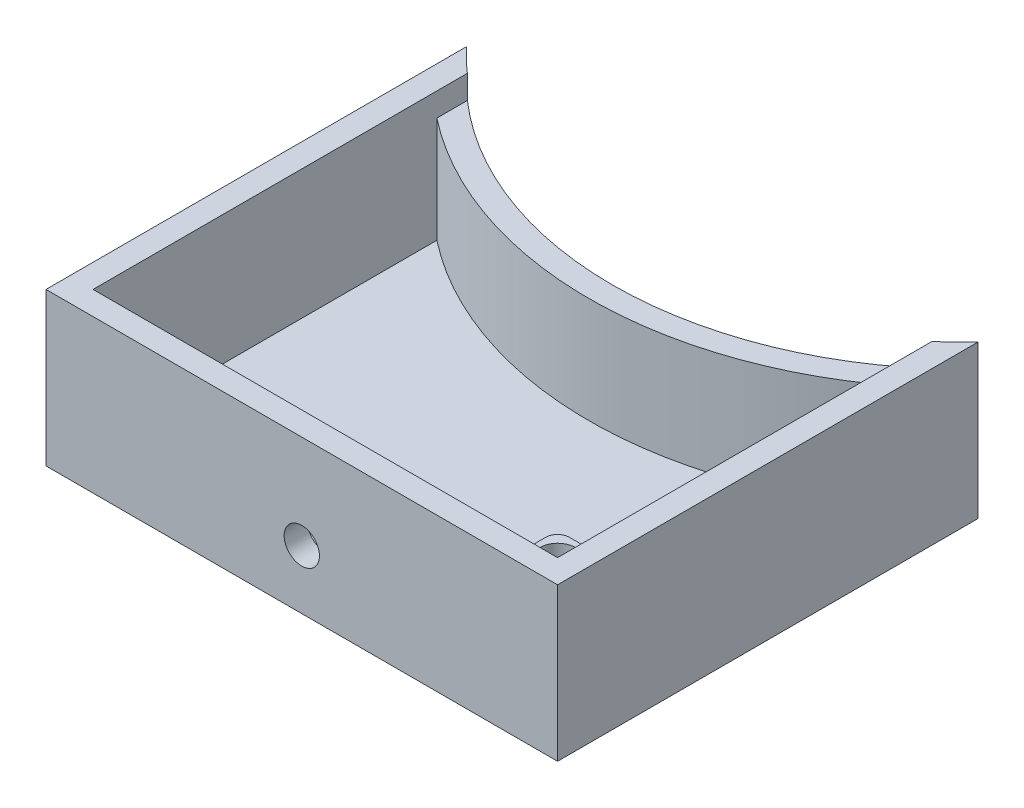
ISO-10303-21;
HEADER;
FILE_DESCRIPTION(('STEP AP214'),'2;1');
FILE_NAME('part.step','',(''),(''),'','','');
FILE_SCHEMA(('AUTOMOTIVE_DESIGN { 1 0 10303 214 1 1 1 1 }'));
ENDSEC;
DATA;
#1=APPLICATION_CONTEXT('core data for automotive mechanical design processes');
#2=APPLICATION_PROTOCOL_DEFINITION('international standard','automotive_design',2000,#1);
#3=PRODUCT_CONTEXT('',#1,'mechanical');
#4=PRODUCT('Part','Part','',(#3));
#5=PRODUCT_RELATED_PRODUCT_CATEGORY('part','',(#4));
#6=PRODUCT_DEFINITION_FORMATION('','',#4);
#7=PRODUCT_DEFINITION_CONTEXT('part definition',#1,'design');
#8=PRODUCT_DEFINITION('design','',#6,#7);
#9=PRODUCT_DEFINITION_SHAPE('','',#8);
#10=(LENGTH_UNIT() NAMED_UNIT(*) SI_UNIT(.MILLI.,.METRE.));
#11=(NAMED_UNIT(*) PLANE_ANGLE_UNIT() SI_UNIT($,.RADIAN.));
#12=(NAMED_UNIT(*) SI_UNIT($,.STERADIAN.) SOLID_ANGLE_UNIT());
#13=UNCERTAINTY_MEASURE_WITH_UNIT(LENGTH_MEASURE(1.E-05),#10,'distance_accuracy_value','');
#14=(GEOMETRIC_REPRESENTATION_CONTEXT(3) GLOBAL_UNCERTAINTY_ASSIGNED_CONTEXT((#13)) GLOBAL_UNIT_ASSIGNED_CONTEXT((#10,
#11,#12)) REPRESENTATION_CONTEXT('',''));
#15=CARTESIAN_POINT('',(0.,0.,0.));
#16=DIRECTION('',(0.,0.,1.));
#17=DIRECTION('',(1.,0.,0.));
#18=AXIS2_PLACEMENT_3D('',#15,#16,#17);
#19=CARTESIAN_POINT('',(0.,13.,15.875));
#20=DIRECTION('',(0.,0.,-1.));
#21=DIRECTION('',(-1.,0.,0.));
#22=AXIS2_PLACEMENT_3D('',#19,#20,#21);
#23=PLANE('',#22);
#24=CARTESIAN_POINT('',(0.,5.,15.875));
#25=DIRECTION('',(0.,0.,-1.));
#26=DIRECTION('',(-1.,0.,0.));
#27=AXIS2_PLACEMENT_3D('',#24,#25,#26);
#28=CIRCLE('',#27,1.5);
#29=CARTESIAN_POINT('',(-1.5,5.,15.875));
#30=VERTEX_POINT('',#29);
#31=EDGE_CURVE('E288',#30,#30,#28,.F.);
#32=ORIENTED_EDGE('',*,*,#31,.T.);
#33=EDGE_LOOP('',(#32));
#34=FACE_BOUND('',#33,.T.);
#35=DIRECTION('',(1.,0.,0.));
#36=VECTOR('',#35,1.);
#37=CARTESIAN_POINT('',(15.75,11.,15.875));
#38=LINE('',#37,#36);
#39=CARTESIAN_POINT('',(15.75,11.,15.875));
#40=VERTEX_POINT('',#39);
#41=CARTESIAN_POINT('',(19.75,11.,15.875));
#42=VERTEX_POINT('',#41);
#43=EDGE_CURVE('E135',#40,#42,#38,.T.);
#44=ORIENTED_EDGE('',*,*,#43,.F.);
#45=DIRECTION('',(0.,-1.,0.));
#46=VECTOR('',#45,1.);
#47=CARTESIAN_POINT('',(15.75,16.6568542494924,15.875));
#48=LINE('',#47,#46);
#49=CARTESIAN_POINT('',(15.75,2.,15.875));
#50=VERTEX_POINT('',#49);
#51=EDGE_CURVE('E220',#40,#50,#48,.T.);
#52=ORIENTED_EDGE('',*,*,#51,.T.);
#53=DIRECTION('',(1.,0.,0.));
#54=VECTOR('',#53,1.);
#55=CARTESIAN_POINT('',(0.,2.,15.875));
#56=LINE('',#55,#54);
#57=CARTESIAN_POINT('',(-19.75,2.,15.875));
#58=VERTEX_POINT('',#57);
#59=EDGE_CURVE('E171',#58,#50,#56,.T.);
#60=ORIENTED_EDGE('',*,*,#59,.F.);
#61=DIRECTION('',(0.,-1.,0.));
#62=VECTOR('',#61,1.);
#63=CARTESIAN_POINT('',(-19.75,13.,15.875));
#64=LINE('',#63,#62);
#65=CARTESIAN_POINT('',(-19.75,13.,15.875));
#66=VERTEX_POINT('',#65);
#67=EDGE_CURVE('E161',#66,#58,#64,.T.);
#68=ORIENTED_EDGE('',*,*,#67,.F.);
#69=DIRECTION('',(1.,0.,0.));
#70=VECTOR('',#69,1.);
#71=CARTESIAN_POINT('',(0.,13.,15.875));
#72=LINE('',#71,#70);
#73=CARTESIAN_POINT('',(19.75,13.,15.875));
#74=VERTEX_POINT('',#73);
#75=EDGE_CURVE('E159',#66,#74,#72,.T.);
#76=ORIENTED_EDGE('',*,*,#75,.T.);
#77=DIRECTION('',(0.,-1.,0.));
#78=VECTOR('',#77,1.);
#79=CARTESIAN_POINT('',(19.75,13.,15.875));
#80=LINE('',#79,#78);
#81=EDGE_CURVE('E150',#74,#42,#80,.T.);
#82=ORIENTED_EDGE('',*,*,#81,.T.);
#83=EDGE_LOOP('',(#44,#52,#60,#68,#76,#82));
#84=FACE_BOUND('',#83,.T.);
#85=ADVANCED_FACE('F35',(#34,#84),#23,.T.);
#86=CARTESIAN_POINT('',(19.75,13.,0.));
#87=DIRECTION('',(1.,0.,0.));
#88=DIRECTION('',(0.,0.,-1.));
#89=AXIS2_PLACEMENT_3D('',#86,#87,#88);
#90=PLANE('',#89);
#91=DIRECTION('',(0.,-1.,0.));
#92=VECTOR('',#91,1.);
#93=CARTESIAN_POINT('',(19.75,16.6568542494924,11.875));
#94=LINE('',#93,#92);
#95=CARTESIAN_POINT('',(19.75,11.,11.875));
#96=VERTEX_POINT('',#95);
#97=CARTESIAN_POINT('',(19.75,2.,11.875));
#98=VERTEX_POINT('',#97);
#99=EDGE_CURVE('E153',#96,#98,#94,.T.);
#100=ORIENTED_EDGE('',*,*,#99,.F.);
#101=DIRECTION('',(0.,0.,-1.));
#102=VECTOR('',#101,1.);
#103=CARTESIAN_POINT('',(19.75,11.,11.875));
#104=LINE('',#103,#102);
#105=EDGE_CURVE('E138',#42,#96,#104,.T.);
#106=ORIENTED_EDGE('',*,*,#105,.F.);
#107=ORIENTED_EDGE('',*,*,#81,.F.);
#108=DIRECTION('',(0.,0.,1.));
#109=VECTOR('',#108,1.);
#110=CARTESIAN_POINT('',(19.75,13.,0.));
#111=LINE('',#110,#109);
#112=CARTESIAN_POINT('',(19.75,13.,-15.9556702053177));
#113=VERTEX_POINT('',#112);
#114=EDGE_CURVE('E167',#113,#74,#111,.T.);
#115=ORIENTED_EDGE('',*,*,#114,.F.);
#116=DIRECTION('',(0.,1.,0.));
#117=VECTOR('',#116,1.);
#118=CARTESIAN_POINT('',(19.75,11.,-15.9556702053177));
#119=LINE('',#118,#117);
#120=CARTESIAN_POINT('',(19.75,11.,-15.9556702053177));
#121=VERTEX_POINT('',#120);
#122=EDGE_CURVE('E276',#121,#113,#119,.T.);
#123=ORIENTED_EDGE('',*,*,#122,.F.);
#124=DIRECTION('',(0.,0.,1.));
#125=VECTOR('',#124,1.);
#126=CARTESIAN_POINT('',(19.75,11.,0.));
#127=LINE('',#126,#125);
#128=CARTESIAN_POINT('',(19.75,11.,-13.3593504735421));
#129=VERTEX_POINT('',#128);
#130=EDGE_CURVE('E283',#121,#129,#127,.T.);
#131=ORIENTED_EDGE('',*,*,#130,.T.);
#132=DIRECTION('',(0.,-1.,0.));
#133=VECTOR('',#132,1.);
#134=CARTESIAN_POINT('',(19.75,13.,-13.3593504735421));
#135=LINE('',#134,#133);
#136=CARTESIAN_POINT('',(19.75,2.,-13.3593504735421));
#137=VERTEX_POINT('',#136);
#138=EDGE_CURVE('E162',#129,#137,#135,.T.);
#139=ORIENTED_EDGE('',*,*,#138,.T.);
#140=DIRECTION('',(0.,0.,1.));
#141=VECTOR('',#140,1.);
#142=CARTESIAN_POINT('',(19.75,2.,0.));
#143=LINE('',#142,#141);
#144=EDGE_CURVE('E172',#137,#98,#143,.T.);
#145=ORIENTED_EDGE('',*,*,#144,.T.);
#146=EDGE_LOOP('',(#100,#106,#107,#115,#123,#131,#139,#145));
#147=FACE_BOUND('',#146,.T.);
#148=ADVANCED_FACE('F149',(#147),#90,.F.);
#149=CARTESIAN_POINT('',(0.,13.,0.));
#150=DIRECTION('',(0.,1.,0.));
#151=DIRECTION('',(0.,0.,1.));
#152=AXIS2_PLACEMENT_3D('',#149,#150,#151);
#153=PLANE('',#152);
#154=CARTESIAN_POINT('',(0.,13.,-38.5374659709339));
#155=DIRECTION('',(0.,1.,0.));
#156=DIRECTION('',(0.,0.,1.));
#157=AXIS2_PLACEMENT_3D('',#154,#155,#156);
#158=CIRCLE('',#157,30.);
#159=CARTESIAN_POINT('',(21.75,13.,-17.875));
#160=VERTEX_POINT('',#159);
#161=EDGE_CURVE('E182',#113,#160,#158,.T.);
#162=ORIENTED_EDGE('',*,*,#161,.F.);
#163=ORIENTED_EDGE('',*,*,#114,.T.);
#164=ORIENTED_EDGE('',*,*,#75,.F.);
#165=DIRECTION('',(0.,0.,1.));
#166=VECTOR('',#165,1.);
#167=CARTESIAN_POINT('',(-19.75,13.,0.));
#168=LINE('',#167,#166);
#169=CARTESIAN_POINT('',(-19.75,13.,-15.9556702053177));
#170=VERTEX_POINT('',#169);
#171=EDGE_CURVE('E174',#170,#66,#168,.T.);
#172=ORIENTED_EDGE('',*,*,#171,.F.);
#173=CARTESIAN_POINT('',(-21.75,13.,-17.875));
#174=VERTEX_POINT('',#173);
#175=EDGE_CURVE('E178',#174,#170,#158,.T.);
#176=ORIENTED_EDGE('',*,*,#175,.F.);
#177=DIRECTION('',(0.,0.,1.));
#178=VECTOR('',#177,1.);
#179=CARTESIAN_POINT('',(-21.75,13.,0.));
#180=LINE('',#179,#178);
#181=CARTESIAN_POINT('',(-21.75,13.,17.875));
#182=VERTEX_POINT('',#181);
#183=EDGE_CURVE('E181',#174,#182,#180,.T.);
#184=ORIENTED_EDGE('',*,*,#183,.T.);
#185=DIRECTION('',(1.,0.,0.));
#186=VECTOR('',#185,1.);
#187=CARTESIAN_POINT('',(0.,13.,17.875));
#188=LINE('',#187,#186);
#189=CARTESIAN_POINT('',(21.75,13.,17.875));
#190=VERTEX_POINT('',#189);
#191=EDGE_CURVE('E184',#182,#190,#188,.T.);
#192=ORIENTED_EDGE('',*,*,#191,.T.);
#193=DIRECTION('',(0.,0.,1.));
#194=VECTOR('',#193,1.);
#195=CARTESIAN_POINT('',(21.75,13.,0.));
#196=LINE('',#195,#194);
#197=EDGE_CURVE('E186',#160,#190,#196,.T.);
#198=ORIENTED_EDGE('',*,*,#197,.F.);
#199=EDGE_LOOP('',(#162,#163,#164,#172,#176,#184,#192,#198));
#200=FACE_BOUND('',#199,.T.);
#201=ADVANCED_FACE('F236',(#200),#153,.T.);
#202=CARTESIAN_POINT('',(0.,13.,-38.5374659709339));
#203=DIRECTION('',(0.,-1.,0.));
#204=DIRECTION('',(0.,0.,-1.));
#205=AXIS2_PLACEMENT_3D('',#202,#203,#204);
#206=CYLINDRICAL_SURFACE('',#205,30.);
#207=CARTESIAN_POINT('',(0.,11.,-38.5374659709339));
#208=DIRECTION('',(0.,1.,0.));
#209=DIRECTION('',(0.,0.,1.));
#210=AXIS2_PLACEMENT_3D('',#207,#208,#209);
#211=CIRCLE('',#210,30.);
#212=CARTESIAN_POINT('',(-19.75,11.,-15.9556702053177));
#213=VERTEX_POINT('',#212);
#214=EDGE_CURVE('E275',#121,#213,#211,.F.);
#215=ORIENTED_EDGE('',*,*,#214,.F.);
#216=ORIENTED_EDGE('',*,*,#122,.T.);
#217=ORIENTED_EDGE('',*,*,#161,.T.);
#218=DIRECTION('',(0.,-1.,0.));
#219=VECTOR('',#218,1.);
#220=CARTESIAN_POINT('',(21.75,13.,-17.875));
#221=LINE('',#220,#219);
#222=CARTESIAN_POINT('',(21.75,0.,-17.875));
#223=VERTEX_POINT('',#222);
#224=EDGE_CURVE('E189',#160,#223,#221,.T.);
#225=ORIENTED_EDGE('',*,*,#224,.T.);
#226=CARTESIAN_POINT('',(0.,0.,-38.5374659709339));
#227=DIRECTION('',(0.,1.,0.));
#228=DIRECTION('',(0.,0.,1.));
#229=AXIS2_PLACEMENT_3D('',#226,#227,#228);
#230=CIRCLE('',#229,30.);
#231=CARTESIAN_POINT('',(-21.75,0.,-17.875));
#232=VERTEX_POINT('',#231);
#233=EDGE_CURVE('E190',#232,#223,#230,.T.);
#234=ORIENTED_EDGE('',*,*,#233,.F.);
#235=DIRECTION('',(0.,-1.,0.));
#236=VECTOR('',#235,1.);
#237=CARTESIAN_POINT('',(-21.75,13.,-17.875));
#238=LINE('',#237,#236);
#239=EDGE_CURVE('E207',#174,#232,#238,.T.);
#240=ORIENTED_EDGE('',*,*,#239,.F.);
#241=ORIENTED_EDGE('',*,*,#175,.T.);
#242=DIRECTION('',(0.,1.,0.));
#243=VECTOR('',#242,1.);
#244=CARTESIAN_POINT('',(-19.75,11.,-15.9556702053177));
#245=LINE('',#244,#243);
#246=EDGE_CURVE('E279',#213,#170,#245,.T.);
#247=ORIENTED_EDGE('',*,*,#246,.F.);
#248=EDGE_LOOP('',(#215,#216,#217,#225,#234,#240,#241,#247));
#249=FACE_BOUND('',#248,.T.);
#250=ADVANCED_FACE('F247',(#249),#206,.F.);
#251=CARTESIAN_POINT('',(0.,13.,-38.5374659709339));
#252=DIRECTION('',(0.,-1.,0.));
#253=DIRECTION('',(0.,0.,-1.));
#254=AXIS2_PLACEMENT_3D('',#251,#252,#253);
#255=CYLINDRICAL_SURFACE('',#254,32.);
#256=CARTESIAN_POINT('',(0.,11.,-38.5374659709339));
#257=DIRECTION('',(0.,1.,0.));
#258=DIRECTION('',(0.,0.,1.));
#259=AXIS2_PLACEMENT_3D('',#256,#257,#258);
#260=CIRCLE('',#259,32.);
#261=CARTESIAN_POINT('',(-19.75,11.,-13.3593504735421));
#262=VERTEX_POINT('',#261);
#263=EDGE_CURVE('E285',#262,#129,#260,.T.);
#264=ORIENTED_EDGE('',*,*,#263,.F.);
#265=DIRECTION('',(0.,-1.,0.));
#266=VECTOR('',#265,1.);
#267=CARTESIAN_POINT('',(-19.75,13.,-13.3593504735421));
#268=LINE('',#267,#266);
#269=CARTESIAN_POINT('',(-19.75,2.,-13.3593504735421));
#270=VERTEX_POINT('',#269);
#271=EDGE_CURVE('E165',#262,#270,#268,.T.);
#272=ORIENTED_EDGE('',*,*,#271,.T.);
#273=CARTESIAN_POINT('',(0.,2.,-38.5374659709339));
#274=DIRECTION('',(0.,1.,0.));
#275=DIRECTION('',(0.,0.,1.));
#276=AXIS2_PLACEMENT_3D('',#273,#274,#275);
#277=CIRCLE('',#276,32.);
#278=EDGE_CURVE('E294',#270,#137,#277,.T.);
#279=ORIENTED_EDGE('',*,*,#278,.T.);
#280=ORIENTED_EDGE('',*,*,#138,.F.);
#281=EDGE_LOOP('',(#264,#272,#279,#280));
#282=FACE_BOUND('',#281,.T.);
#283=ADVANCED_FACE('F263',(#282),#255,.T.);
#284=CARTESIAN_POINT('',(-21.75,13.,0.));
#285=DIRECTION('',(1.,0.,0.));
#286=DIRECTION('',(0.,0.,-1.));
#287=AXIS2_PLACEMENT_3D('',#284,#285,#286);
#288=PLANE('',#287);
#289=DIRECTION('',(0.,0.,1.));
#290=VECTOR('',#289,1.);
#291=CARTESIAN_POINT('',(-21.75,0.,0.));
#292=LINE('',#291,#290);
#293=CARTESIAN_POINT('',(-21.75,0.,17.875));
#294=VERTEX_POINT('',#293);
#295=EDGE_CURVE('E193',#232,#294,#292,.T.);
#296=ORIENTED_EDGE('',*,*,#295,.T.);
#297=DIRECTION('',(0.,-1.,0.));
#298=VECTOR('',#297,1.);
#299=CARTESIAN_POINT('',(-21.75,13.,17.875));
#300=LINE('',#299,#298);
#301=EDGE_CURVE('E204',#182,#294,#300,.T.);
#302=ORIENTED_EDGE('',*,*,#301,.F.);
#303=ORIENTED_EDGE('',*,*,#183,.F.);
#304=ORIENTED_EDGE('',*,*,#239,.T.);
#305=EDGE_LOOP('',(#296,#302,#303,#304));
#306=FACE_BOUND('',#305,.T.);
#307=ADVANCED_FACE('F260',(#306),#288,.F.);
#308=CARTESIAN_POINT('',(0.,13.,17.875));
#309=DIRECTION('',(0.,0.,-1.));
#310=DIRECTION('',(-1.,0.,0.));
#311=AXIS2_PLACEMENT_3D('',#308,#309,#310);
#312=PLANE('',#311);
#313=CARTESIAN_POINT('',(0.,5.,17.875));
#314=DIRECTION('',(0.,0.,1.));
#315=DIRECTION('',(1.,0.,0.));
#316=AXIS2_PLACEMENT_3D('',#313,#314,#315);
#317=CIRCLE('',#316,1.5);
#318=CARTESIAN_POINT('',(1.5,5.,17.875));
#319=VERTEX_POINT('',#318);
#320=EDGE_CURVE('E306',#319,#319,#317,.T.);
#321=ORIENTED_EDGE('',*,*,#320,.F.);
#322=EDGE_LOOP('',(#321));
#323=FACE_BOUND('',#322,.T.);
#324=DIRECTION('',(1.,0.,0.));
#325=VECTOR('',#324,1.);
#326=CARTESIAN_POINT('',(0.,0.,17.875));
#327=LINE('',#326,#325);
#328=CARTESIAN_POINT('',(21.75,0.,17.875));
#329=VERTEX_POINT('',#328);
#330=EDGE_CURVE('E195',#294,#329,#327,.T.);
#331=ORIENTED_EDGE('',*,*,#330,.T.);
#332=DIRECTION('',(0.,-1.,0.));
#333=VECTOR('',#332,1.);
#334=CARTESIAN_POINT('',(21.75,13.,17.875));
#335=LINE('',#334,#333);
#336=EDGE_CURVE('E202',#190,#329,#335,.T.);
#337=ORIENTED_EDGE('',*,*,#336,.F.);
#338=ORIENTED_EDGE('',*,*,#191,.F.);
#339=ORIENTED_EDGE('',*,*,#301,.T.);
#340=EDGE_LOOP('',(#331,#337,#338,#339));
#341=FACE_BOUND('',#340,.T.);
#342=ADVANCED_FACE('F256',(#323,#341),#312,.F.);
#343=CARTESIAN_POINT('',(21.75,13.,0.));
#344=DIRECTION('',(1.,0.,0.));
#345=DIRECTION('',(0.,0.,-1.));
#346=AXIS2_PLACEMENT_3D('',#343,#344,#345);
#347=PLANE('',#346);
#348=DIRECTION('',(0.,0.,1.));
#349=VECTOR('',#348,1.);
#350=CARTESIAN_POINT('',(21.75,0.,0.));
#351=LINE('',#350,#349);
#352=EDGE_CURVE('E198',#223,#329,#351,.T.);
#353=ORIENTED_EDGE('',*,*,#352,.F.);
#354=ORIENTED_EDGE('',*,*,#224,.F.);
#355=ORIENTED_EDGE('',*,*,#197,.T.);
#356=ORIENTED_EDGE('',*,*,#336,.T.);
#357=EDGE_LOOP('',(#353,#354,#355,#356));
#358=FACE_BOUND('',#357,.T.);
#359=ADVANCED_FACE('F252',(#358),#347,.T.);
#360=CARTESIAN_POINT('',(0.,0.,0.));
#361=DIRECTION('',(0.,1.,0.));
#362=DIRECTION('',(0.,0.,1.));
#363=AXIS2_PLACEMENT_3D('',#360,#361,#362);
#364=PLANE('',#363);
#365=ORIENTED_EDGE('',*,*,#233,.T.);
#366=ORIENTED_EDGE('',*,*,#352,.T.);
#367=ORIENTED_EDGE('',*,*,#330,.F.);
#368=ORIENTED_EDGE('',*,*,#295,.F.);
#369=EDGE_LOOP('',(#365,#366,#367,#368));
#370=FACE_BOUND('',#369,.T.);
#371=ADVANCED_FACE('F249',(#370),#364,.F.);
#372=CARTESIAN_POINT('',(-19.75,13.,0.));
#373=DIRECTION('',(1.,0.,0.));
#374=DIRECTION('',(0.,0.,-1.));
#375=AXIS2_PLACEMENT_3D('',#372,#373,#374);
#376=PLANE('',#375);
#377=DIRECTION('',(0.,0.,1.));
#378=VECTOR('',#377,1.);
#379=CARTESIAN_POINT('',(-19.75,2.,0.));
#380=LINE('',#379,#378);
#381=EDGE_CURVE('E298',#270,#58,#380,.T.);
#382=ORIENTED_EDGE('',*,*,#381,.F.);
#383=ORIENTED_EDGE('',*,*,#271,.F.);
#384=DIRECTION('',(0.,0.,1.));
#385=VECTOR('',#384,1.);
#386=CARTESIAN_POINT('',(-19.75,11.,0.));
#387=LINE('',#386,#385);
#388=EDGE_CURVE('E282',#213,#262,#387,.T.);
#389=ORIENTED_EDGE('',*,*,#388,.F.);
#390=ORIENTED_EDGE('',*,*,#246,.T.);
#391=ORIENTED_EDGE('',*,*,#171,.T.);
#392=ORIENTED_EDGE('',*,*,#67,.T.);
#393=EDGE_LOOP('',(#382,#383,#389,#390,#391,#392));
#394=FACE_BOUND('',#393,.T.);
#395=ADVANCED_FACE('F240',(#394),#376,.T.);
#396=CARTESIAN_POINT('',(0.,2.,0.));
#397=DIRECTION('',(0.,1.,0.));
#398=DIRECTION('',(0.,0.,1.));
#399=AXIS2_PLACEMENT_3D('',#396,#397,#398);
#400=PLANE('',#399);
#401=ORIENTED_EDGE('',*,*,#59,.T.);
#402=DIRECTION('',(0.,0.,1.));
#403=VECTOR('',#402,1.);
#404=CARTESIAN_POINT('',(15.75,2.,11.875));
#405=LINE('',#404,#403);
#406=CARTESIAN_POINT('',(15.75,2.,12.875));
#407=VERTEX_POINT('',#406);
#408=EDGE_CURVE('E304',#407,#50,#405,.T.);
#409=ORIENTED_EDGE('',*,*,#408,.F.);
#410=CARTESIAN_POINT('',(16.75,2.,12.875));
#411=DIRECTION('',(0.,1.,0.));
#412=DIRECTION('',(0.,0.,1.));
#413=AXIS2_PLACEMENT_3D('',#410,#411,#412);
#414=CIRCLE('',#413,1.);
#415=CARTESIAN_POINT('',(16.75,2.,11.875));
#416=VERTEX_POINT('',#415);
#417=EDGE_CURVE('E11',#407,#416,#414,.F.);
#418=ORIENTED_EDGE('',*,*,#417,.T.);
#419=DIRECTION('',(-1.,0.,0.));
#420=VECTOR('',#419,1.);
#421=CARTESIAN_POINT('',(15.75,2.,11.875));
#422=LINE('',#421,#420);
#423=EDGE_CURVE('E154',#98,#416,#422,.T.);
#424=ORIENTED_EDGE('',*,*,#423,.F.);
#425=ORIENTED_EDGE('',*,*,#144,.F.);
#426=ORIENTED_EDGE('',*,*,#278,.F.);
#427=ORIENTED_EDGE('',*,*,#381,.T.);
#428=EDGE_LOOP('',(#401,#409,#418,#424,#425,#426,#427));
#429=FACE_BOUND('',#428,.T.);
#430=ADVANCED_FACE('F229',(#429),#400,.T.);
#431=CARTESIAN_POINT('',(0.,11.,0.));
#432=DIRECTION('',(0.,1.,0.));
#433=DIRECTION('',(0.,0.,1.));
#434=AXIS2_PLACEMENT_3D('',#431,#432,#433);
#435=PLANE('',#434);
#436=ORIENTED_EDGE('',*,*,#130,.F.);
#437=ORIENTED_EDGE('',*,*,#214,.T.);
#438=ORIENTED_EDGE('',*,*,#388,.T.);
#439=ORIENTED_EDGE('',*,*,#263,.T.);
#440=EDGE_LOOP('',(#436,#437,#438,#439));
#441=FACE_BOUND('',#440,.T.);
#442=ADVANCED_FACE('F244',(#441),#435,.T.);
#443=CARTESIAN_POINT('',(0.,5.,-17.876));
#444=DIRECTION('',(0.,0.,1.));
#445=DIRECTION('',(1.,0.,0.));
#446=AXIS2_PLACEMENT_3D('',#443,#444,#445);
#447=CYLINDRICAL_SURFACE('',#446,1.5);
#448=ORIENTED_EDGE('',*,*,#31,.F.);
#449=EDGE_LOOP('',(#448));
#450=FACE_BOUND('',#449,.T.);
#451=ORIENTED_EDGE('',*,*,#320,.T.);
#452=EDGE_LOOP('',(#451));
#453=FACE_BOUND('',#452,.T.);
#454=ADVANCED_FACE('F316',(#450,#453),#447,.F.);
#455=CARTESIAN_POINT('',(15.75,16.6568542494924,11.875));
#456=DIRECTION('',(1.,0.,0.));
#457=DIRECTION('',(0.,0.,-1.));
#458=AXIS2_PLACEMENT_3D('',#455,#456,#457);
#459=PLANE('',#458);
#460=DIRECTION('',(0.,0.,1.));
#461=VECTOR('',#460,1.);
#462=CARTESIAN_POINT('',(15.75,11.,11.875));
#463=LINE('',#462,#461);
#464=CARTESIAN_POINT('',(15.75,11.,12.875));
#465=VERTEX_POINT('',#464);
#466=EDGE_CURVE('E141',#465,#40,#463,.T.);
#467=ORIENTED_EDGE('',*,*,#466,.F.);
#468=DIRECTION('',(0.,-1.,0.));
#469=VECTOR('',#468,1.);
#470=CARTESIAN_POINT('',(15.75,16.6568542494924,12.875));
#471=LINE('',#470,#469);
#472=EDGE_CURVE('E212',#465,#407,#471,.T.);
#473=ORIENTED_EDGE('',*,*,#472,.T.);
#474=ORIENTED_EDGE('',*,*,#408,.T.);
#475=ORIENTED_EDGE('',*,*,#51,.F.);
#476=EDGE_LOOP('',(#467,#473,#474,#475));
#477=FACE_BOUND('',#476,.T.);
#478=ADVANCED_FACE('F219',(#477),#459,.F.);
#479=CARTESIAN_POINT('',(15.75,16.6568542494924,11.875));
#480=DIRECTION('',(0.,0.,1.));
#481=DIRECTION('',(1.,0.,0.));
#482=AXIS2_PLACEMENT_3D('',#479,#480,#481);
#483=PLANE('',#482);
#484=ORIENTED_EDGE('',*,*,#423,.T.);
#485=DIRECTION('',(0.,-1.,0.));
#486=VECTOR('',#485,1.);
#487=CARTESIAN_POINT('',(16.75,16.6568542494924,11.875));
#488=LINE('',#487,#486);
#489=CARTESIAN_POINT('',(16.75,11.,11.875));
#490=VERTEX_POINT('',#489);
#491=EDGE_CURVE('E55',#416,#490,#488,.F.);
#492=ORIENTED_EDGE('',*,*,#491,.T.);
#493=DIRECTION('',(-1.,0.,0.));
#494=VECTOR('',#493,1.);
#495=CARTESIAN_POINT('',(15.75,11.,11.875));
#496=LINE('',#495,#494);
#497=EDGE_CURVE('E155',#96,#490,#496,.T.);
#498=ORIENTED_EDGE('',*,*,#497,.F.);
#499=ORIENTED_EDGE('',*,*,#99,.T.);
#500=EDGE_LOOP('',(#484,#492,#498,#499));
#501=FACE_BOUND('',#500,.T.);
#502=ADVANCED_FACE('F335',(#501),#483,.F.);
#503=CARTESIAN_POINT('',(17.75,16.6568542494924,13.875));
#504=DIRECTION('',(0.,-1.,0.));
#505=DIRECTION('',(0.,0.,-1.));
#506=AXIS2_PLACEMENT_3D('',#503,#504,#505);
#507=CYLINDRICAL_SURFACE('',#506,1.5);
#508=CARTESIAN_POINT('',(17.75,2.,13.875));
#509=DIRECTION('',(0.,1.,0.));
#510=DIRECTION('',(0.,0.,1.));
#511=AXIS2_PLACEMENT_3D('',#508,#509,#510);
#512=CIRCLE('',#511,1.5);
#513=CARTESIAN_POINT('',(17.75,2.,15.375));
#514=VERTEX_POINT('',#513);
#515=EDGE_CURVE('E209',#514,#514,#512,.F.);
#516=ORIENTED_EDGE('',*,*,#515,.T.);
#517=EDGE_LOOP('',(#516));
#518=FACE_BOUND('',#517,.T.);
#519=CARTESIAN_POINT('',(17.75,11.,13.875));
#520=DIRECTION('',(0.,1.,0.));
#521=DIRECTION('',(0.,0.,1.));
#522=AXIS2_PLACEMENT_3D('',#519,#520,#521);
#523=CIRCLE('',#522,1.5);
#524=CARTESIAN_POINT('',(17.75,11.,15.375));
#525=VERTEX_POINT('',#524);
#526=EDGE_CURVE('E146',#525,#525,#523,.T.);
#527=ORIENTED_EDGE('',*,*,#526,.T.);
#528=EDGE_LOOP('',(#527));
#529=FACE_BOUND('',#528,.T.);
#530=ADVANCED_FACE('F337',(#518,#529),#507,.F.);
#531=CARTESIAN_POINT('',(0.,11.,0.));
#532=DIRECTION('',(0.,1.,0.));
#533=DIRECTION('',(0.,0.,1.));
#534=AXIS2_PLACEMENT_3D('',#531,#532,#533);
#535=PLANE('',#534);
#536=ORIENTED_EDGE('',*,*,#526,.F.);
#537=EDGE_LOOP('',(#536));
#538=FACE_BOUND('',#537,.T.);
#539=ORIENTED_EDGE('',*,*,#497,.T.);
#540=CARTESIAN_POINT('',(16.75,11.,12.875));
#541=DIRECTION('',(0.,1.,0.));
#542=DIRECTION('',(0.,0.,1.));
#543=AXIS2_PLACEMENT_3D('',#540,#541,#542);
#544=CIRCLE('',#543,1.);
#545=EDGE_CURVE('E43',#490,#465,#544,.T.);
#546=ORIENTED_EDGE('',*,*,#545,.T.);
#547=ORIENTED_EDGE('',*,*,#466,.T.);
#548=ORIENTED_EDGE('',*,*,#43,.T.);
#549=ORIENTED_EDGE('',*,*,#105,.T.);
#550=EDGE_LOOP('',(#539,#546,#547,#548,#549));
#551=FACE_BOUND('',#550,.T.);
#552=ADVANCED_FACE('F137',(#538,#551),#535,.T.);
#553=ORIENTED_EDGE('',*,*,#515,.F.);
#554=EDGE_LOOP('',(#553));
#555=FACE_BOUND('',#554,.T.);
#556=ADVANCED_FACE('F223',(#555),#400,.T.);
#557=CARTESIAN_POINT('',(16.75,16.6568542494924,12.875));
#558=DIRECTION('',(0.,-1.,0.));
#559=DIRECTION('',(0.,0.,-1.));
#560=AXIS2_PLACEMENT_3D('',#557,#558,#559);
#561=CYLINDRICAL_SURFACE('',#560,1.);
#562=ORIENTED_EDGE('',*,*,#545,.F.);
#563=ORIENTED_EDGE('',*,*,#491,.F.);
#564=ORIENTED_EDGE('',*,*,#417,.F.);
#565=ORIENTED_EDGE('',*,*,#472,.F.);
#566=EDGE_LOOP('',(#562,#563,#564,#565));
#567=FACE_BOUND('',#566,.T.);
#568=ADVANCED_FACE('F37',(#567),#561,.T.);
#569=CLOSED_SHELL('',(#85,#148,#201,#250,#283,#307,#342,#359,#371,#395,#430,#442,#454,#478,#502,
#530,#552,#556,#568));
#570=MANIFOLD_SOLID_BREP('B2',#569);
#571=ADVANCED_BREP_SHAPE_REPRESENTATION('',(#18,#570),#14);
#572=SHAPE_DEFINITION_REPRESENTATION(#9,#571);
ENDSEC;
END-ISO-10303-21;
